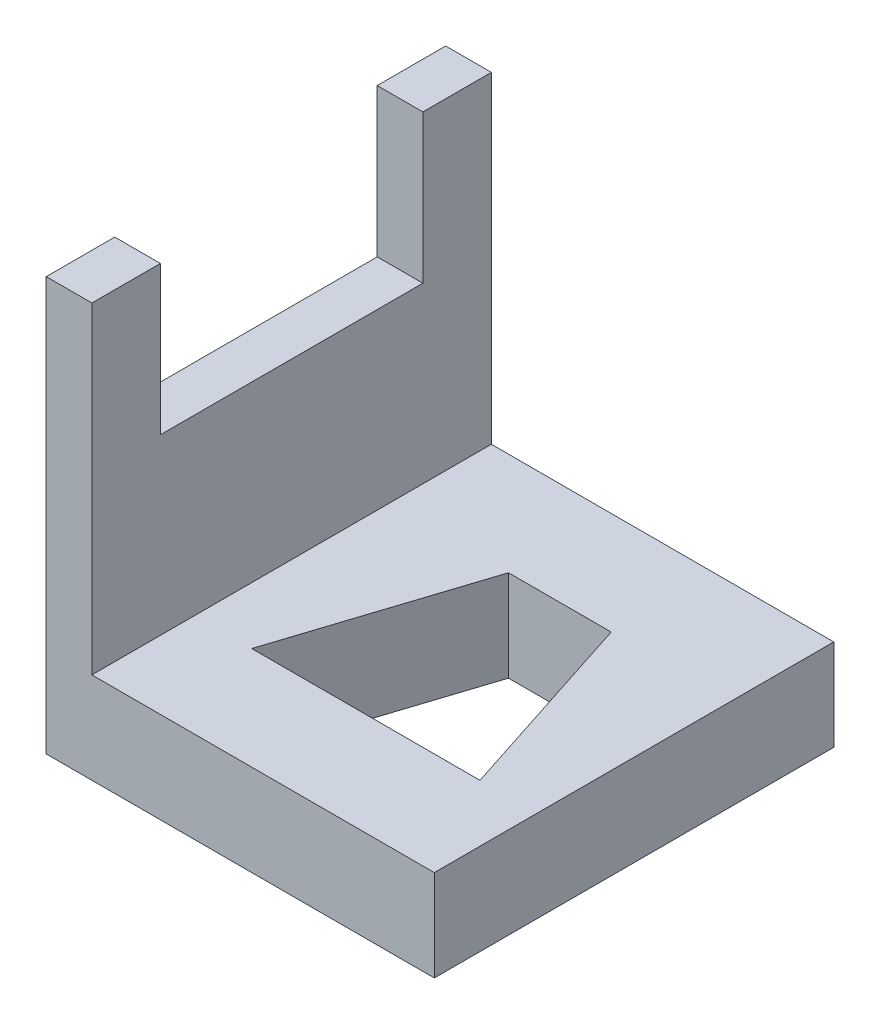
ISO-10303-21;
HEADER;
FILE_DESCRIPTION(('STEP AP214'),'2;1');
FILE_NAME('part.step','',(''),(''),'','','');
FILE_SCHEMA(('AUTOMOTIVE_DESIGN { 1 0 10303 214 1 1 1 1 }'));
ENDSEC;
DATA;
#1=APPLICATION_CONTEXT('core data for automotive mechanical design processes');
#2=APPLICATION_PROTOCOL_DEFINITION('international standard','automotive_design',2000,#1);
#3=PRODUCT_CONTEXT('',#1,'mechanical');
#4=PRODUCT('Part','Part','',(#3));
#5=PRODUCT_RELATED_PRODUCT_CATEGORY('part','',(#4));
#6=PRODUCT_DEFINITION_FORMATION('','',#4);
#7=PRODUCT_DEFINITION_CONTEXT('part definition',#1,'design');
#8=PRODUCT_DEFINITION('design','',#6,#7);
#9=PRODUCT_DEFINITION_SHAPE('','',#8);
#10=(LENGTH_UNIT() NAMED_UNIT(*) SI_UNIT(.MILLI.,.METRE.));
#11=(NAMED_UNIT(*) PLANE_ANGLE_UNIT() SI_UNIT($,.RADIAN.));
#12=(NAMED_UNIT(*) SI_UNIT($,.STERADIAN.) SOLID_ANGLE_UNIT());
#13=UNCERTAINTY_MEASURE_WITH_UNIT(LENGTH_MEASURE(1.E-05),#10,'distance_accuracy_value','');
#14=(GEOMETRIC_REPRESENTATION_CONTEXT(3) GLOBAL_UNCERTAINTY_ASSIGNED_CONTEXT((#13)) GLOBAL_UNIT_ASSIGNED_CONTEXT((#10,
#11,#12)) REPRESENTATION_CONTEXT('',''));
#15=CARTESIAN_POINT('',(0.,0.,0.));
#16=DIRECTION('',(0.,0.,1.));
#17=DIRECTION('',(1.,0.,0.));
#18=AXIS2_PLACEMENT_3D('',#15,#16,#17);
#19=CARTESIAN_POINT('',(-3477.38095238095,1222.86597938144,1778.));
#20=DIRECTION('',(0.,-1.,0.));
#21=DIRECTION('',(0.,0.,-1.));
#22=AXIS2_PLACEMENT_3D('',#19,#20,#21);
#23=PLANE('',#22);
#24=DIRECTION('',(0.,0.,-1.));
#25=VECTOR('',#24,1.);
#26=CARTESIAN_POINT('',(-3680.58095238095,1222.86597938144,1778.));
#27=LINE('',#26,#25);
#28=CARTESIAN_POINT('',(-3680.58095238095,1222.86597938144,304.8));
#29=VERTEX_POINT('',#28);
#30=CARTESIAN_POINT('',(-3680.58095238095,1222.86597938144,0.));
#31=VERTEX_POINT('',#30);
#32=EDGE_CURVE('E54',#29,#31,#27,.T.);
#33=ORIENTED_EDGE('',*,*,#32,.F.);
#34=DIRECTION('',(-1.,0.,0.));
#35=VECTOR('',#34,1.);
#36=CARTESIAN_POINT('',(-3477.38095238095,1222.86597938144,304.8));
#37=LINE('',#36,#35);
#38=CARTESIAN_POINT('',(-3477.38095238095,1222.86597938144,304.8));
#39=VERTEX_POINT('',#38);
#40=EDGE_CURVE('E219',#39,#29,#37,.T.);
#41=ORIENTED_EDGE('',*,*,#40,.F.);
#42=DIRECTION('',(0.,0.,-1.));
#43=VECTOR('',#42,1.);
#44=CARTESIAN_POINT('',(-3477.38095238095,1222.86597938144,1778.));
#45=LINE('',#44,#43);
#46=CARTESIAN_POINT('',(-3477.38095238095,1222.86597938144,0.));
#47=VERTEX_POINT('',#46);
#48=EDGE_CURVE('E252',#39,#47,#45,.T.);
#49=ORIENTED_EDGE('',*,*,#48,.T.);
#50=DIRECTION('',(-1.,0.,0.));
#51=VECTOR('',#50,1.);
#52=CARTESIAN_POINT('',(-3477.38095238095,1222.86597938144,0.));
#53=LINE('',#52,#51);
#54=EDGE_CURVE('E222',#47,#31,#53,.T.);
#55=ORIENTED_EDGE('',*,*,#54,.T.);
#56=EDGE_LOOP('',(#33,#41,#49,#55));
#57=FACE_BOUND('',#56,.T.);
#58=ADVANCED_FACE('F45',(#57),#23,.F.);
#59=CARTESIAN_POINT('',(-3477.38095238095,1222.86597938144,1778.));
#60=VERTEX_POINT('',#59);
#61=CARTESIAN_POINT('',(-3477.38095238095,1222.86597938144,1473.2));
#62=VERTEX_POINT('',#61);
#63=EDGE_CURVE('E271',#60,#62,#45,.T.);
#64=ORIENTED_EDGE('',*,*,#63,.T.);
#65=DIRECTION('',(-1.,0.,0.));
#66=VECTOR('',#65,1.);
#67=CARTESIAN_POINT('',(-3477.38095238095,1222.86597938144,1473.2));
#68=LINE('',#67,#66);
#69=CARTESIAN_POINT('',(-3680.58095238095,1222.86597938144,1473.2));
#70=VERTEX_POINT('',#69);
#71=EDGE_CURVE('E223',#62,#70,#68,.T.);
#72=ORIENTED_EDGE('',*,*,#71,.T.);
#73=CARTESIAN_POINT('',(-3680.58095238095,1222.86597938144,1778.));
#74=VERTEX_POINT('',#73);
#75=EDGE_CURVE('E11',#74,#70,#27,.T.);
#76=ORIENTED_EDGE('',*,*,#75,.F.);
#77=DIRECTION('',(-1.,0.,0.));
#78=VECTOR('',#77,1.);
#79=CARTESIAN_POINT('',(-3477.38095238095,1222.86597938144,1778.));
#80=LINE('',#79,#78);
#81=EDGE_CURVE('E232',#60,#74,#80,.T.);
#82=ORIENTED_EDGE('',*,*,#81,.F.);
#83=EDGE_LOOP('',(#64,#72,#76,#82));
#84=FACE_BOUND('',#83,.T.);
#85=ADVANCED_FACE('F47',(#84),#23,.F.);
#86=CARTESIAN_POINT('',(-3680.58095238095,1222.86597938144,1778.));
#87=DIRECTION('',(1.,0.,0.));
#88=DIRECTION('',(0.,1.,0.));
#89=AXIS2_PLACEMENT_3D('',#86,#87,#88);
#90=PLANE('',#89);
#91=DIRECTION('',(0.,0.,1.));
#92=VECTOR('',#91,1.);
#93=CARTESIAN_POINT('',(-3680.58095238095,562.465979381442,304.8));
#94=LINE('',#93,#92);
#95=CARTESIAN_POINT('',(-3680.58095238095,562.465979381442,304.8));
#96=VERTEX_POINT('',#95);
#97=CARTESIAN_POINT('',(-3680.58095238095,562.465979381442,1473.2));
#98=VERTEX_POINT('',#97);
#99=EDGE_CURVE('E213',#96,#98,#94,.T.);
#100=ORIENTED_EDGE('',*,*,#99,.F.);
#101=DIRECTION('',(0.,-1.,0.));
#102=VECTOR('',#101,1.);
#103=CARTESIAN_POINT('',(-3680.58095238095,1222.86597938144,304.8));
#104=LINE('',#103,#102);
#105=EDGE_CURVE('E190',#29,#96,#104,.T.);
#106=ORIENTED_EDGE('',*,*,#105,.F.);
#107=ORIENTED_EDGE('',*,*,#32,.T.);
#108=DIRECTION('',(0.,-1.,0.));
#109=VECTOR('',#108,1.);
#110=CARTESIAN_POINT('',(-3680.58095238095,1222.86597938144,0.));
#111=LINE('',#110,#109);
#112=CARTESIAN_POINT('',(-3680.58095238095,-617.106529209622,0.));
#113=VERTEX_POINT('',#112);
#114=EDGE_CURVE('E256',#31,#113,#111,.T.);
#115=ORIENTED_EDGE('',*,*,#114,.T.);
#116=DIRECTION('',(0.,0.,-1.));
#117=VECTOR('',#116,1.);
#118=CARTESIAN_POINT('',(-3680.58095238095,-617.106529209622,1778.));
#119=LINE('',#118,#117);
#120=CARTESIAN_POINT('',(-3680.58095238095,-617.106529209622,1778.));
#121=VERTEX_POINT('',#120);
#122=EDGE_CURVE('E286',#121,#113,#119,.T.);
#123=ORIENTED_EDGE('',*,*,#122,.F.);
#124=DIRECTION('',(0.,-1.,0.));
#125=VECTOR('',#124,1.);
#126=CARTESIAN_POINT('',(-3680.58095238095,1222.86597938144,1778.));
#127=LINE('',#126,#125);
#128=EDGE_CURVE('E236',#74,#121,#127,.T.);
#129=ORIENTED_EDGE('',*,*,#128,.F.);
#130=ORIENTED_EDGE('',*,*,#75,.T.);
#131=DIRECTION('',(0.,1.,0.));
#132=VECTOR('',#131,1.);
#133=CARTESIAN_POINT('',(-3680.58095238095,1222.86597938144,1473.2));
#134=LINE('',#133,#132);
#135=EDGE_CURVE('E201',#98,#70,#134,.T.);
#136=ORIENTED_EDGE('',*,*,#135,.F.);
#137=EDGE_LOOP('',(#100,#106,#107,#115,#123,#129,#130,#136));
#138=FACE_BOUND('',#137,.T.);
#139=ADVANCED_FACE('F298',(#138),#90,.F.);
#140=CARTESIAN_POINT('',(-3680.58095238095,-617.106529209622,1778.));
#141=DIRECTION('',(0.,1.,0.));
#142=DIRECTION('',(-1.,0.,0.));
#143=AXIS2_PLACEMENT_3D('',#140,#141,#142);
#144=PLANE('',#143);
#145=DIRECTION('',(1.,0.,0.));
#146=VECTOR('',#145,1.);
#147=CARTESIAN_POINT('',(-3223.38095238095,-617.106529209622,1320.8));
#148=LINE('',#147,#146);
#149=CARTESIAN_POINT('',(-3223.38095238095,-617.106529209622,1320.8));
#150=VERTEX_POINT('',#149);
#151=CARTESIAN_POINT('',(-2207.38095238095,-617.106529209622,1320.8));
#152=VERTEX_POINT('',#151);
#153=EDGE_CURVE('E156',#150,#152,#148,.T.);
#154=ORIENTED_EDGE('',*,*,#153,.T.);
#155=DIRECTION('',(-0.307820285414662,0.,-0.951444518554411));
#156=VECTOR('',#155,1.);
#157=CARTESIAN_POINT('',(-2486.78095238095,-617.106529209622,457.2));
#158=LINE('',#157,#156);
#159=CARTESIAN_POINT('',(-2486.78095238095,-617.106529209622,457.2));
#160=VERTEX_POINT('',#159);
#161=EDGE_CURVE('E149',#152,#160,#158,.T.);
#162=ORIENTED_EDGE('',*,*,#161,.T.);
#163=DIRECTION('',(-1.,0.,0.));
#164=VECTOR('',#163,1.);
#165=CARTESIAN_POINT('',(-2943.98095238095,-617.106529209622,457.2));
#166=LINE('',#165,#164);
#167=CARTESIAN_POINT('',(-2943.98095238095,-617.106529209622,457.2));
#168=VERTEX_POINT('',#167);
#169=EDGE_CURVE('E159',#160,#168,#166,.T.);
#170=ORIENTED_EDGE('',*,*,#169,.T.);
#171=DIRECTION('',(-0.307820285414662,0.,0.951444518554411));
#172=VECTOR('',#171,1.);
#173=CARTESIAN_POINT('',(-2943.98095238095,-617.106529209622,457.2));
#174=LINE('',#173,#172);
#175=EDGE_CURVE('E61',#168,#150,#174,.T.);
#176=ORIENTED_EDGE('',*,*,#175,.T.);
#177=EDGE_LOOP('',(#154,#162,#170,#176));
#178=FACE_BOUND('',#177,.T.);
#179=DIRECTION('',(1.,0.,0.));
#180=VECTOR('',#179,1.);
#181=CARTESIAN_POINT('',(-3680.58095238095,-617.106529209622,0.));
#182=LINE('',#181,#180);
#183=CARTESIAN_POINT('',(-1953.38095238095,-617.106529209622,0.));
#184=VERTEX_POINT('',#183);
#185=EDGE_CURVE('E259',#113,#184,#182,.T.);
#186=ORIENTED_EDGE('',*,*,#185,.T.);
#187=DIRECTION('',(0.,0.,-1.));
#188=VECTOR('',#187,1.);
#189=CARTESIAN_POINT('',(-1953.38095238095,-617.106529209622,1778.));
#190=LINE('',#189,#188);
#191=CARTESIAN_POINT('',(-1953.38095238095,-617.106529209622,1778.));
#192=VERTEX_POINT('',#191);
#193=EDGE_CURVE('E283',#192,#184,#190,.T.);
#194=ORIENTED_EDGE('',*,*,#193,.F.);
#195=DIRECTION('',(1.,0.,0.));
#196=VECTOR('',#195,1.);
#197=CARTESIAN_POINT('',(-3680.58095238095,-617.106529209622,1778.));
#198=LINE('',#197,#196);
#199=EDGE_CURVE('E240',#121,#192,#198,.T.);
#200=ORIENTED_EDGE('',*,*,#199,.F.);
#201=ORIENTED_EDGE('',*,*,#122,.T.);
#202=EDGE_LOOP('',(#186,#194,#200,#201));
#203=FACE_BOUND('',#202,.T.);
#204=ADVANCED_FACE('F164',(#178,#203),#144,.F.);
#205=CARTESIAN_POINT('',(-1953.38095238095,-617.106529209622,1778.));
#206=DIRECTION('',(-1.,0.,0.));
#207=DIRECTION('',(0.,0.,1.));
#208=AXIS2_PLACEMENT_3D('',#205,#206,#207);
#209=PLANE('',#208);
#210=DIRECTION('',(0.,1.,0.));
#211=VECTOR('',#210,1.);
#212=CARTESIAN_POINT('',(-1953.38095238095,-617.106529209622,0.));
#213=LINE('',#212,#211);
#214=CARTESIAN_POINT('',(-1953.38095238095,-210.706529209622,0.));
#215=VERTEX_POINT('',#214);
#216=EDGE_CURVE('E262',#184,#215,#213,.T.);
#217=ORIENTED_EDGE('',*,*,#216,.T.);
#218=DIRECTION('',(0.,0.,-1.));
#219=VECTOR('',#218,1.);
#220=CARTESIAN_POINT('',(-1953.38095238095,-210.706529209622,1778.));
#221=LINE('',#220,#219);
#222=CARTESIAN_POINT('',(-1953.38095238095,-210.706529209622,1778.));
#223=VERTEX_POINT('',#222);
#224=EDGE_CURVE('E279',#223,#215,#221,.T.);
#225=ORIENTED_EDGE('',*,*,#224,.F.);
#226=DIRECTION('',(0.,1.,0.));
#227=VECTOR('',#226,1.);
#228=CARTESIAN_POINT('',(-1953.38095238095,-617.106529209622,1778.));
#229=LINE('',#228,#227);
#230=EDGE_CURVE('E243',#192,#223,#229,.T.);
#231=ORIENTED_EDGE('',*,*,#230,.F.);
#232=ORIENTED_EDGE('',*,*,#193,.T.);
#233=EDGE_LOOP('',(#217,#225,#231,#232));
#234=FACE_BOUND('',#233,.T.);
#235=ADVANCED_FACE('F319',(#234),#209,.F.);
#236=CARTESIAN_POINT('',(-1953.38095238095,-210.706529209622,1778.));
#237=DIRECTION('',(0.,-1.,0.));
#238=DIRECTION('',(1.,0.,0.));
#239=AXIS2_PLACEMENT_3D('',#236,#237,#238);
#240=PLANE('',#239);
#241=DIRECTION('',(-1.,0.,0.));
#242=VECTOR('',#241,1.);
#243=CARTESIAN_POINT('',(-2943.98095238095,-210.706529209622,457.2));
#244=LINE('',#243,#242);
#245=CARTESIAN_POINT('',(-2486.78095238095,-210.706529209622,457.2));
#246=VERTEX_POINT('',#245);
#247=CARTESIAN_POINT('',(-2943.98095238095,-210.706529209622,457.2));
#248=VERTEX_POINT('',#247);
#249=EDGE_CURVE('E181',#246,#248,#244,.T.);
#250=ORIENTED_EDGE('',*,*,#249,.F.);
#251=DIRECTION('',(-0.307820285414662,0.,-0.951444518554411));
#252=VECTOR('',#251,1.);
#253=CARTESIAN_POINT('',(-2486.78095238095,-210.706529209622,457.2));
#254=LINE('',#253,#252);
#255=CARTESIAN_POINT('',(-2207.38095238095,-210.706529209622,1320.8));
#256=VERTEX_POINT('',#255);
#257=EDGE_CURVE('E69',#256,#246,#254,.T.);
#258=ORIENTED_EDGE('',*,*,#257,.F.);
#259=DIRECTION('',(1.,0.,0.));
#260=VECTOR('',#259,1.);
#261=CARTESIAN_POINT('',(-3223.38095238095,-210.706529209622,1320.8));
#262=LINE('',#261,#260);
#263=CARTESIAN_POINT('',(-3223.38095238095,-210.706529209622,1320.8));
#264=VERTEX_POINT('',#263);
#265=EDGE_CURVE('E168',#264,#256,#262,.T.);
#266=ORIENTED_EDGE('',*,*,#265,.F.);
#267=DIRECTION('',(-0.307820285414662,0.,0.951444518554411));
#268=VECTOR('',#267,1.);
#269=CARTESIAN_POINT('',(-2943.98095238095,-210.706529209622,457.2));
#270=LINE('',#269,#268);
#271=EDGE_CURVE('E172',#248,#264,#270,.T.);
#272=ORIENTED_EDGE('',*,*,#271,.F.);
#273=EDGE_LOOP('',(#250,#258,#266,#272));
#274=FACE_BOUND('',#273,.T.);
#275=DIRECTION('',(-1.,0.,0.));
#276=VECTOR('',#275,1.);
#277=CARTESIAN_POINT('',(-1953.38095238095,-210.706529209622,0.));
#278=LINE('',#277,#276);
#279=CARTESIAN_POINT('',(-3477.38095238095,-210.706529209622,0.));
#280=VERTEX_POINT('',#279);
#281=EDGE_CURVE('E265',#215,#280,#278,.T.);
#282=ORIENTED_EDGE('',*,*,#281,.T.);
#283=DIRECTION('',(0.,0.,-1.));
#284=VECTOR('',#283,1.);
#285=CARTESIAN_POINT('',(-3477.38095238095,-210.706529209622,1778.));
#286=LINE('',#285,#284);
#287=CARTESIAN_POINT('',(-3477.38095238095,-210.706529209622,1778.));
#288=VERTEX_POINT('',#287);
#289=EDGE_CURVE('E275',#288,#280,#286,.T.);
#290=ORIENTED_EDGE('',*,*,#289,.F.);
#291=DIRECTION('',(-1.,0.,0.));
#292=VECTOR('',#291,1.);
#293=CARTESIAN_POINT('',(-1953.38095238095,-210.706529209622,1778.));
#294=LINE('',#293,#292);
#295=EDGE_CURVE('E246',#223,#288,#294,.T.);
#296=ORIENTED_EDGE('',*,*,#295,.F.);
#297=ORIENTED_EDGE('',*,*,#224,.T.);
#298=EDGE_LOOP('',(#282,#290,#296,#297));
#299=FACE_BOUND('',#298,.T.);
#300=ADVANCED_FACE('F314',(#274,#299),#240,.F.);
#301=CARTESIAN_POINT('',(-3477.38095238095,-210.706529209622,1778.));
#302=DIRECTION('',(-1.,0.,0.));
#303=DIRECTION('',(0.,0.,1.));
#304=AXIS2_PLACEMENT_3D('',#301,#302,#303);
#305=PLANE('',#304);
#306=ORIENTED_EDGE('',*,*,#48,.F.);
#307=DIRECTION('',(0.,-1.,0.));
#308=VECTOR('',#307,1.);
#309=CARTESIAN_POINT('',(-3477.38095238095,1222.86597938144,304.8));
#310=LINE('',#309,#308);
#311=CARTESIAN_POINT('',(-3477.38095238095,562.465979381442,304.8));
#312=VERTEX_POINT('',#311);
#313=EDGE_CURVE('E196',#39,#312,#310,.T.);
#314=ORIENTED_EDGE('',*,*,#313,.T.);
#315=DIRECTION('',(0.,0.,1.));
#316=VECTOR('',#315,1.);
#317=CARTESIAN_POINT('',(-3477.38095238095,562.465979381442,304.8));
#318=LINE('',#317,#316);
#319=CARTESIAN_POINT('',(-3477.38095238095,562.465979381442,1473.2));
#320=VERTEX_POINT('',#319);
#321=EDGE_CURVE('E200',#312,#320,#318,.T.);
#322=ORIENTED_EDGE('',*,*,#321,.T.);
#323=DIRECTION('',(0.,1.,0.));
#324=VECTOR('',#323,1.);
#325=CARTESIAN_POINT('',(-3477.38095238095,1222.86597938144,1473.2));
#326=LINE('',#325,#324);
#327=EDGE_CURVE('E205',#320,#62,#326,.T.);
#328=ORIENTED_EDGE('',*,*,#327,.T.);
#329=ORIENTED_EDGE('',*,*,#63,.F.);
#330=DIRECTION('',(0.,1.,0.));
#331=VECTOR('',#330,1.);
#332=CARTESIAN_POINT('',(-3477.38095238095,-210.706529209622,1778.));
#333=LINE('',#332,#331);
#334=EDGE_CURVE('E249',#288,#60,#333,.T.);
#335=ORIENTED_EDGE('',*,*,#334,.F.);
#336=ORIENTED_EDGE('',*,*,#289,.T.);
#337=DIRECTION('',(0.,1.,0.));
#338=VECTOR('',#337,1.);
#339=CARTESIAN_POINT('',(-3477.38095238095,-210.706529209622,0.));
#340=LINE('',#339,#338);
#341=EDGE_CURVE('E237',#280,#47,#340,.T.);
#342=ORIENTED_EDGE('',*,*,#341,.T.);
#343=EDGE_LOOP('',(#306,#314,#322,#328,#329,#335,#336,#342));
#344=FACE_BOUND('',#343,.T.);
#345=ADVANCED_FACE('F309',(#344),#305,.F.);
#346=CARTESIAN_POINT('',(0.,0.,1778.));
#347=DIRECTION('',(0.,0.,1.));
#348=DIRECTION('',(1.,0.,0.));
#349=AXIS2_PLACEMENT_3D('',#346,#347,#348);
#350=PLANE('',#349);
#351=ORIENTED_EDGE('',*,*,#81,.T.);
#352=ORIENTED_EDGE('',*,*,#128,.T.);
#353=ORIENTED_EDGE('',*,*,#199,.T.);
#354=ORIENTED_EDGE('',*,*,#230,.T.);
#355=ORIENTED_EDGE('',*,*,#295,.T.);
#356=ORIENTED_EDGE('',*,*,#334,.T.);
#357=EDGE_LOOP('',(#351,#352,#353,#354,#355,#356));
#358=FACE_BOUND('',#357,.T.);
#359=ADVANCED_FACE('F322',(#358),#350,.T.);
#360=CARTESIAN_POINT('',(0.,0.,0.));
#361=DIRECTION('',(0.,0.,1.));
#362=DIRECTION('',(1.,0.,0.));
#363=AXIS2_PLACEMENT_3D('',#360,#361,#362);
#364=PLANE('',#363);
#365=ORIENTED_EDGE('',*,*,#54,.F.);
#366=ORIENTED_EDGE('',*,*,#341,.F.);
#367=ORIENTED_EDGE('',*,*,#281,.F.);
#368=ORIENTED_EDGE('',*,*,#216,.F.);
#369=ORIENTED_EDGE('',*,*,#185,.F.);
#370=ORIENTED_EDGE('',*,*,#114,.F.);
#371=EDGE_LOOP('',(#365,#366,#367,#368,#369,#370));
#372=FACE_BOUND('',#371,.T.);
#373=ADVANCED_FACE('F303',(#372),#364,.F.);
#374=CARTESIAN_POINT('',(-3477.38095238095,1222.86597938144,304.8));
#375=DIRECTION('',(0.,0.,-1.));
#376=DIRECTION('',(0.,1.,0.));
#377=AXIS2_PLACEMENT_3D('',#374,#375,#376);
#378=PLANE('',#377);
#379=ORIENTED_EDGE('',*,*,#105,.T.);
#380=DIRECTION('',(-1.,0.,0.));
#381=VECTOR('',#380,1.);
#382=CARTESIAN_POINT('',(-3477.38095238095,562.465979381442,304.8));
#383=LINE('',#382,#381);
#384=EDGE_CURVE('E209',#312,#96,#383,.T.);
#385=ORIENTED_EDGE('',*,*,#384,.F.);
#386=ORIENTED_EDGE('',*,*,#313,.F.);
#387=ORIENTED_EDGE('',*,*,#40,.T.);
#388=EDGE_LOOP('',(#379,#385,#386,#387));
#389=FACE_BOUND('',#388,.T.);
#390=ADVANCED_FACE('F335',(#389),#378,.F.);
#391=CARTESIAN_POINT('',(-3477.38095238095,1222.86597938144,1473.2));
#392=DIRECTION('',(0.,0.,1.));
#393=DIRECTION('',(0.,-1.,0.));
#394=AXIS2_PLACEMENT_3D('',#391,#392,#393);
#395=PLANE('',#394);
#396=ORIENTED_EDGE('',*,*,#135,.T.);
#397=ORIENTED_EDGE('',*,*,#71,.F.);
#398=ORIENTED_EDGE('',*,*,#327,.F.);
#399=DIRECTION('',(-1.,0.,0.));
#400=VECTOR('',#399,1.);
#401=CARTESIAN_POINT('',(-3477.38095238095,562.465979381442,1473.2));
#402=LINE('',#401,#400);
#403=EDGE_CURVE('E227',#320,#98,#402,.T.);
#404=ORIENTED_EDGE('',*,*,#403,.T.);
#405=EDGE_LOOP('',(#396,#397,#398,#404));
#406=FACE_BOUND('',#405,.T.);
#407=ADVANCED_FACE('F329',(#406),#395,.F.);
#408=CARTESIAN_POINT('',(-3477.38095238095,562.465979381442,304.8));
#409=DIRECTION('',(0.,-1.,0.));
#410=DIRECTION('',(1.,0.,0.));
#411=AXIS2_PLACEMENT_3D('',#408,#409,#410);
#412=PLANE('',#411);
#413=ORIENTED_EDGE('',*,*,#99,.T.);
#414=ORIENTED_EDGE('',*,*,#403,.F.);
#415=ORIENTED_EDGE('',*,*,#321,.F.);
#416=ORIENTED_EDGE('',*,*,#384,.T.);
#417=EDGE_LOOP('',(#413,#414,#415,#416));
#418=FACE_BOUND('',#417,.T.);
#419=ADVANCED_FACE('F333',(#418),#412,.F.);
#420=CARTESIAN_POINT('',(-2486.78095238095,-617.106529209622,457.2));
#421=DIRECTION('',(0.951444518554411,0.,-0.307820285414662));
#422=DIRECTION('',(-0.307820285414662,0.,-0.951444518554411));
#423=AXIS2_PLACEMENT_3D('',#420,#421,#422);
#424=PLANE('',#423);
#425=ORIENTED_EDGE('',*,*,#257,.T.);
#426=DIRECTION('',(0.,1.,0.));
#427=VECTOR('',#426,1.);
#428=CARTESIAN_POINT('',(-2486.78095238095,-617.106529209622,457.2));
#429=LINE('',#428,#427);
#430=EDGE_CURVE('E145',#160,#246,#429,.T.);
#431=ORIENTED_EDGE('',*,*,#430,.F.);
#432=ORIENTED_EDGE('',*,*,#161,.F.);
#433=DIRECTION('',(0.,1.,0.));
#434=VECTOR('',#433,1.);
#435=CARTESIAN_POINT('',(-2207.38095238095,-617.106529209622,1320.8));
#436=LINE('',#435,#434);
#437=EDGE_CURVE('E187',#152,#256,#436,.T.);
#438=ORIENTED_EDGE('',*,*,#437,.T.);
#439=EDGE_LOOP('',(#425,#431,#432,#438));
#440=FACE_BOUND('',#439,.T.);
#441=ADVANCED_FACE('F147',(#440),#424,.F.);
#442=CARTESIAN_POINT('',(-3223.38095238095,-617.106529209622,1320.8));
#443=DIRECTION('',(0.,0.,1.));
#444=DIRECTION('',(1.,0.,0.));
#445=AXIS2_PLACEMENT_3D('',#442,#443,#444);
#446=PLANE('',#445);
#447=ORIENTED_EDGE('',*,*,#265,.T.);
#448=ORIENTED_EDGE('',*,*,#437,.F.);
#449=ORIENTED_EDGE('',*,*,#153,.F.);
#450=DIRECTION('',(0.,1.,0.));
#451=VECTOR('',#450,1.);
#452=CARTESIAN_POINT('',(-3223.38095238095,-617.106529209622,1320.8));
#453=LINE('',#452,#451);
#454=EDGE_CURVE('E191',#150,#264,#453,.T.);
#455=ORIENTED_EDGE('',*,*,#454,.T.);
#456=EDGE_LOOP('',(#447,#448,#449,#455));
#457=FACE_BOUND('',#456,.T.);
#458=ADVANCED_FACE('F406',(#457),#446,.F.);
#459=CARTESIAN_POINT('',(-2943.98095238095,-617.106529209622,457.2));
#460=DIRECTION('',(-0.951444518554411,0.,-0.307820285414662));
#461=DIRECTION('',(-0.307820285414662,0.,0.951444518554411));
#462=AXIS2_PLACEMENT_3D('',#459,#460,#461);
#463=PLANE('',#462);
#464=ORIENTED_EDGE('',*,*,#271,.T.);
#465=ORIENTED_EDGE('',*,*,#454,.F.);
#466=ORIENTED_EDGE('',*,*,#175,.F.);
#467=DIRECTION('',(0.,1.,0.));
#468=VECTOR('',#467,1.);
#469=CARTESIAN_POINT('',(-2943.98095238095,-617.106529209622,457.2));
#470=LINE('',#469,#468);
#471=EDGE_CURVE('E155',#168,#248,#470,.T.);
#472=ORIENTED_EDGE('',*,*,#471,.T.);
#473=EDGE_LOOP('',(#464,#465,#466,#472));
#474=FACE_BOUND('',#473,.T.);
#475=ADVANCED_FACE('F415',(#474),#463,.F.);
#476=CARTESIAN_POINT('',(-2943.98095238095,-617.106529209622,457.2));
#477=DIRECTION('',(0.,0.,-1.));
#478=DIRECTION('',(-1.,0.,0.));
#479=AXIS2_PLACEMENT_3D('',#476,#477,#478);
#480=PLANE('',#479);
#481=ORIENTED_EDGE('',*,*,#249,.T.);
#482=ORIENTED_EDGE('',*,*,#471,.F.);
#483=ORIENTED_EDGE('',*,*,#169,.F.);
#484=ORIENTED_EDGE('',*,*,#430,.T.);
#485=EDGE_LOOP('',(#481,#482,#483,#484));
#486=FACE_BOUND('',#485,.T.);
#487=ADVANCED_FACE('F160',(#486),#480,.F.);
#488=CLOSED_SHELL('',(#58,#85,#139,#204,#235,#300,#345,#359,#373,#390,#407,#419,#441,#458,#475,#487));
#489=MANIFOLD_SOLID_BREP('B2',#488);
#490=ADVANCED_BREP_SHAPE_REPRESENTATION('',(#18,#489),#14);
#491=SHAPE_DEFINITION_REPRESENTATION(#9,#490);
ENDSEC;
END-ISO-10303-21;
